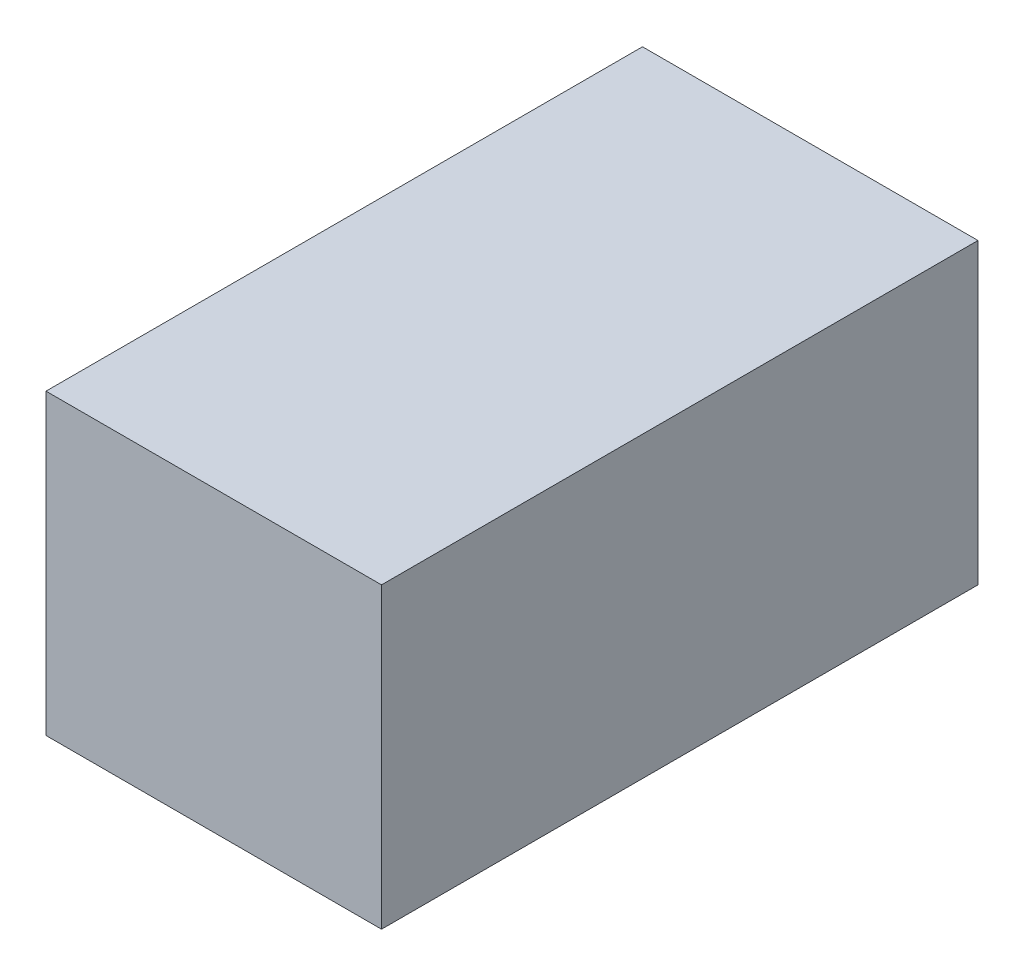
ISO-10303-21;
HEADER;
FILE_DESCRIPTION(('STEP AP214'),'2;1');
FILE_NAME('part.step','',(''),(''),'','','');
FILE_SCHEMA(('AUTOMOTIVE_DESIGN { 1 0 10303 214 1 1 1 1 }'));
ENDSEC;
DATA;
#1=APPLICATION_CONTEXT('core data for automotive mechanical design processes');
#2=APPLICATION_PROTOCOL_DEFINITION('international standard','automotive_design',2000,#1);
#3=PRODUCT_CONTEXT('',#1,'mechanical');
#4=PRODUCT('Part','Part','',(#3));
#5=PRODUCT_RELATED_PRODUCT_CATEGORY('part','',(#4));
#6=PRODUCT_DEFINITION_FORMATION('','',#4);
#7=PRODUCT_DEFINITION_CONTEXT('part definition',#1,'design');
#8=PRODUCT_DEFINITION('design','',#6,#7);
#9=PRODUCT_DEFINITION_SHAPE('','',#8);
#10=(LENGTH_UNIT() NAMED_UNIT(*) SI_UNIT(.MILLI.,.METRE.));
#11=(NAMED_UNIT(*) PLANE_ANGLE_UNIT() SI_UNIT($,.RADIAN.));
#12=(NAMED_UNIT(*) SI_UNIT($,.STERADIAN.) SOLID_ANGLE_UNIT());
#13=UNCERTAINTY_MEASURE_WITH_UNIT(LENGTH_MEASURE(1.E-05),#10,'distance_accuracy_value','');
#14=(GEOMETRIC_REPRESENTATION_CONTEXT(3) GLOBAL_UNCERTAINTY_ASSIGNED_CONTEXT((#13)) GLOBAL_UNIT_ASSIGNED_CONTEXT((#10,
#11,#12)) REPRESENTATION_CONTEXT('',''));
#15=CARTESIAN_POINT('',(0.,0.,0.));
#16=DIRECTION('',(0.,0.,1.));
#17=DIRECTION('',(1.,0.,0.));
#18=AXIS2_PLACEMENT_3D('',#15,#16,#17);
#19=CARTESIAN_POINT('',(45.,42.1150592216582,20.4399323181049));
#20=DIRECTION('',(0.,0.,-1.));
#21=DIRECTION('',(0.,1.,0.));
#22=AXIS2_PLACEMENT_3D('',#19,#20,#21);
#23=PLANE('',#22);
#24=DIRECTION('',(0.,-1.,0.));
#25=VECTOR('',#24,1.);
#26=CARTESIAN_POINT('',(0.,42.1150592216582,20.4399323181049));
#27=LINE('',#26,#25);
#28=CARTESIAN_POINT('',(0.,42.1150592216582,20.4399323181049));
#29=VERTEX_POINT('',#28);
#30=CARTESIAN_POINT('',(0.,2.1150592216582,20.4399323181049));
#31=VERTEX_POINT('',#30);
#32=EDGE_CURVE('E100',#29,#31,#27,.T.);
#33=ORIENTED_EDGE('',*,*,#32,.T.);
#34=DIRECTION('',(-1.,0.,0.));
#35=VECTOR('',#34,1.);
#36=CARTESIAN_POINT('',(45.,2.1150592216582,20.4399323181049));
#37=LINE('',#36,#35);
#38=CARTESIAN_POINT('',(45.,2.1150592216582,20.4399323181049));
#39=VERTEX_POINT('',#38);
#40=EDGE_CURVE('E11',#39,#31,#37,.T.);
#41=ORIENTED_EDGE('',*,*,#40,.F.);
#42=DIRECTION('',(0.,-1.,0.));
#43=VECTOR('',#42,1.);
#44=CARTESIAN_POINT('',(45.,42.1150592216582,20.4399323181049));
#45=LINE('',#44,#43);
#46=CARTESIAN_POINT('',(45.,42.1150592216582,20.4399323181049));
#47=VERTEX_POINT('',#46);
#48=EDGE_CURVE('E88',#47,#39,#45,.T.);
#49=ORIENTED_EDGE('',*,*,#48,.F.);
#50=DIRECTION('',(-1.,0.,0.));
#51=VECTOR('',#50,1.);
#52=CARTESIAN_POINT('',(45.,42.1150592216582,20.4399323181049));
#53=LINE('',#52,#51);
#54=EDGE_CURVE('E96',#47,#29,#53,.T.);
#55=ORIENTED_EDGE('',*,*,#54,.T.);
#56=EDGE_LOOP('',(#33,#41,#49,#55));
#57=FACE_BOUND('',#56,.T.);
#58=ADVANCED_FACE('F37',(#57),#23,.F.);
#59=CARTESIAN_POINT('',(45.,2.1150592216582,20.4399323181049));
#60=DIRECTION('',(0.,1.,0.));
#61=DIRECTION('',(0.,0.,1.));
#62=AXIS2_PLACEMENT_3D('',#59,#60,#61);
#63=PLANE('',#62);
#64=DIRECTION('',(0.,0.,-1.));
#65=VECTOR('',#64,1.);
#66=CARTESIAN_POINT('',(0.,2.1150592216582,20.4399323181049));
#67=LINE('',#66,#65);
#68=CARTESIAN_POINT('',(0.,2.1150592216582,-59.5600676818951));
#69=VERTEX_POINT('',#68);
#70=EDGE_CURVE('E92',#31,#69,#67,.T.);
#71=ORIENTED_EDGE('',*,*,#70,.T.);
#72=DIRECTION('',(-1.,0.,0.));
#73=VECTOR('',#72,1.);
#74=CARTESIAN_POINT('',(45.,2.1150592216582,-59.5600676818951));
#75=LINE('',#74,#73);
#76=CARTESIAN_POINT('',(45.,2.1150592216582,-59.5600676818951));
#77=VERTEX_POINT('',#76);
#78=EDGE_CURVE('E45',#77,#69,#75,.T.);
#79=ORIENTED_EDGE('',*,*,#78,.F.);
#80=DIRECTION('',(0.,0.,-1.));
#81=VECTOR('',#80,1.);
#82=CARTESIAN_POINT('',(45.,2.1150592216582,20.4399323181049));
#83=LINE('',#82,#81);
#84=EDGE_CURVE('E83',#39,#77,#83,.T.);
#85=ORIENTED_EDGE('',*,*,#84,.F.);
#86=ORIENTED_EDGE('',*,*,#40,.T.);
#87=EDGE_LOOP('',(#71,#79,#85,#86));
#88=FACE_BOUND('',#87,.T.);
#89=ADVANCED_FACE('F91',(#88),#63,.F.);
#90=CARTESIAN_POINT('',(45.,42.1150592216582,-59.5600676818951));
#91=DIRECTION('',(0.,0.,1.));
#92=DIRECTION('',(0.,-1.,0.));
#93=AXIS2_PLACEMENT_3D('',#90,#91,#92);
#94=PLANE('',#93);
#95=DIRECTION('',(0.,1.,0.));
#96=VECTOR('',#95,1.);
#97=CARTESIAN_POINT('',(0.,42.1150592216582,-59.5600676818951));
#98=LINE('',#97,#96);
#99=CARTESIAN_POINT('',(0.,42.1150592216582,-59.5600676818951));
#100=VERTEX_POINT('',#99);
#101=EDGE_CURVE('E70',#69,#100,#98,.T.);
#102=ORIENTED_EDGE('',*,*,#101,.T.);
#103=DIRECTION('',(-1.,0.,0.));
#104=VECTOR('',#103,1.);
#105=CARTESIAN_POINT('',(45.,42.1150592216582,-59.5600676818951));
#106=LINE('',#105,#104);
#107=CARTESIAN_POINT('',(45.,42.1150592216582,-59.5600676818951));
#108=VERTEX_POINT('',#107);
#109=EDGE_CURVE('E93',#108,#100,#106,.T.);
#110=ORIENTED_EDGE('',*,*,#109,.F.);
#111=DIRECTION('',(0.,1.,0.));
#112=VECTOR('',#111,1.);
#113=CARTESIAN_POINT('',(45.,42.1150592216582,-59.5600676818951));
#114=LINE('',#113,#112);
#115=EDGE_CURVE('E86',#77,#108,#114,.T.);
#116=ORIENTED_EDGE('',*,*,#115,.F.);
#117=ORIENTED_EDGE('',*,*,#78,.T.);
#118=EDGE_LOOP('',(#102,#110,#116,#117));
#119=FACE_BOUND('',#118,.T.);
#120=ADVANCED_FACE('F94',(#119),#94,.F.);
#121=CARTESIAN_POINT('',(45.,42.1150592216582,20.4399323181049));
#122=DIRECTION('',(0.,-1.,0.));
#123=DIRECTION('',(0.,0.,-1.));
#124=AXIS2_PLACEMENT_3D('',#121,#122,#123);
#125=PLANE('',#124);
#126=DIRECTION('',(0.,0.,1.));
#127=VECTOR('',#126,1.);
#128=CARTESIAN_POINT('',(0.,42.1150592216582,20.4399323181049));
#129=LINE('',#128,#127);
#130=EDGE_CURVE('E76',#100,#29,#129,.T.);
#131=ORIENTED_EDGE('',*,*,#130,.T.);
#132=ORIENTED_EDGE('',*,*,#54,.F.);
#133=DIRECTION('',(0.,0.,1.));
#134=VECTOR('',#133,1.);
#135=CARTESIAN_POINT('',(45.,42.1150592216582,20.4399323181049));
#136=LINE('',#135,#134);
#137=EDGE_CURVE('E53',#108,#47,#136,.T.);
#138=ORIENTED_EDGE('',*,*,#137,.F.);
#139=ORIENTED_EDGE('',*,*,#109,.T.);
#140=EDGE_LOOP('',(#131,#132,#138,#139));
#141=FACE_BOUND('',#140,.T.);
#142=ADVANCED_FACE('F107',(#141),#125,.F.);
#143=CARTESIAN_POINT('',(45.,0.,0.));
#144=DIRECTION('',(1.,0.,0.));
#145=DIRECTION('',(0.,0.,-1.));
#146=AXIS2_PLACEMENT_3D('',#143,#144,#145);
#147=PLANE('',#146);
#148=ORIENTED_EDGE('',*,*,#48,.T.);
#149=ORIENTED_EDGE('',*,*,#84,.T.);
#150=ORIENTED_EDGE('',*,*,#115,.T.);
#151=ORIENTED_EDGE('',*,*,#137,.T.);
#152=EDGE_LOOP('',(#148,#149,#150,#151));
#153=FACE_BOUND('',#152,.T.);
#154=ADVANCED_FACE('F84',(#153),#147,.T.);
#155=CARTESIAN_POINT('',(0.,0.,0.));
#156=DIRECTION('',(1.,0.,0.));
#157=DIRECTION('',(0.,0.,-1.));
#158=AXIS2_PLACEMENT_3D('',#155,#156,#157);
#159=PLANE('',#158);
#160=ORIENTED_EDGE('',*,*,#32,.F.);
#161=ORIENTED_EDGE('',*,*,#130,.F.);
#162=ORIENTED_EDGE('',*,*,#101,.F.);
#163=ORIENTED_EDGE('',*,*,#70,.F.);
#164=EDGE_LOOP('',(#160,#161,#162,#163));
#165=FACE_BOUND('',#164,.T.);
#166=ADVANCED_FACE('F110',(#165),#159,.F.);
#167=CLOSED_SHELL('',(#58,#89,#120,#142,#154,#166));
#168=MANIFOLD_SOLID_BREP('B2',#167);
#169=ADVANCED_BREP_SHAPE_REPRESENTATION('',(#18,#168),#14);
#170=SHAPE_DEFINITION_REPRESENTATION(#9,#169);
ENDSEC;
END-ISO-10303-21;
